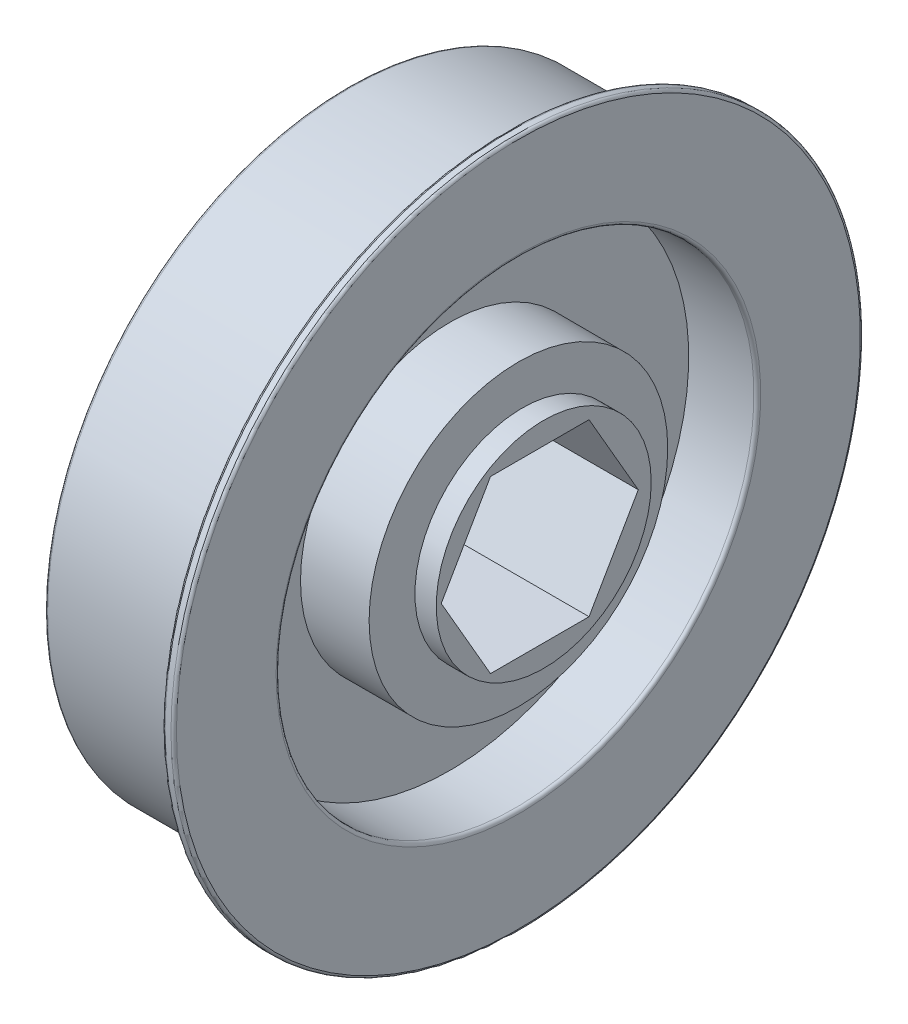
ISO-10303-21;
HEADER;
FILE_DESCRIPTION(('STEP AP214'),'2;1');
FILE_NAME('part.step','',(''),(''),'','','');
FILE_SCHEMA(('AUTOMOTIVE_DESIGN { 1 0 10303 214 1 1 1 1 }'));
ENDSEC;
DATA;
#1=APPLICATION_CONTEXT('core data for automotive mechanical design processes');
#2=APPLICATION_PROTOCOL_DEFINITION('international standard','automotive_design',2000,#1);
#3=PRODUCT_CONTEXT('',#1,'mechanical');
#4=PRODUCT('Part','Part','',(#3));
#5=PRODUCT_RELATED_PRODUCT_CATEGORY('part','',(#4));
#6=PRODUCT_DEFINITION_FORMATION('','',#4);
#7=PRODUCT_DEFINITION_CONTEXT('part definition',#1,'design');
#8=PRODUCT_DEFINITION('design','',#6,#7);
#9=PRODUCT_DEFINITION_SHAPE('','',#8);
#10=(LENGTH_UNIT() NAMED_UNIT(*) SI_UNIT(.MILLI.,.METRE.));
#11=(NAMED_UNIT(*) PLANE_ANGLE_UNIT() SI_UNIT($,.RADIAN.));
#12=(NAMED_UNIT(*) SI_UNIT($,.STERADIAN.) SOLID_ANGLE_UNIT());
#13=UNCERTAINTY_MEASURE_WITH_UNIT(LENGTH_MEASURE(1.E-05),#10,'distance_accuracy_value','');
#14=(GEOMETRIC_REPRESENTATION_CONTEXT(3) GLOBAL_UNCERTAINTY_ASSIGNED_CONTEXT((#13)) GLOBAL_UNIT_ASSIGNED_CONTEXT((#10,
#11,#12)) REPRESENTATION_CONTEXT('',''));
#15=CARTESIAN_POINT('',(0.,0.,0.));
#16=DIRECTION('',(0.,0.,1.));
#17=DIRECTION('',(1.,0.,0.));
#18=AXIS2_PLACEMENT_3D('',#15,#16,#17);
#19=CARTESIAN_POINT('',(10.3224617446627,0.,0.));
#20=DIRECTION('',(-1.,0.,0.));
#21=DIRECTION('',(0.,0.,1.));
#22=AXIS2_PLACEMENT_3D('',#19,#20,#21);
#23=CYLINDRICAL_SURFACE('',#22,11.1125);
#24=CARTESIAN_POINT('',(-1.13665,0.,0.));
#25=DIRECTION('',(-1.,0.,0.));
#26=DIRECTION('',(0.,0.,1.));
#27=AXIS2_PLACEMENT_3D('',#24,#25,#26);
#28=CIRCLE('',#27,11.1125);
#29=CARTESIAN_POINT('',(-1.13665,0.,11.1125));
#30=VERTEX_POINT('',#29);
#31=EDGE_CURVE('E146',#30,#30,#28,.T.);
#32=ORIENTED_EDGE('',*,*,#31,.F.);
#33=EDGE_LOOP('',(#32));
#34=FACE_BOUND('',#33,.T.);
#35=CARTESIAN_POINT('',(3.96875,0.,0.));
#36=DIRECTION('',(1.,0.,0.));
#37=DIRECTION('',(0.,0.,-1.));
#38=AXIS2_PLACEMENT_3D('',#35,#36,#37);
#39=CIRCLE('',#38,11.1125);
#40=CARTESIAN_POINT('',(3.96875,0.,-11.1125));
#41=VERTEX_POINT('',#40);
#42=EDGE_CURVE('E113',#41,#41,#39,.T.);
#43=ORIENTED_EDGE('',*,*,#42,.F.);
#44=EDGE_LOOP('',(#43));
#45=FACE_BOUND('',#44,.T.);
#46=ADVANCED_FACE('F35',(#34,#45),#23,.T.);
#47=CARTESIAN_POINT('',(5.55625,0.,0.));
#48=DIRECTION('',(1.,0.,0.));
#49=DIRECTION('',(0.,0.,-1.));
#50=AXIS2_PLACEMENT_3D('',#47,#48,#49);
#51=PLANE('',#50);
#52=DIRECTION('',(0.,0.866025403784438,-0.5));
#53=VECTOR('',#52,1.);
#54=CARTESIAN_POINT('',(5.55625,0.,7.33234841870825));
#55=LINE('',#54,#53);
#56=CARTESIAN_POINT('',(5.55625,0.,7.33234841870825));
#57=VERTEX_POINT('',#56);
#58=CARTESIAN_POINT('',(5.55625,6.35,3.66617420935412));
#59=VERTEX_POINT('',#58);
#60=EDGE_CURVE('E90',#57,#59,#55,.T.);
#61=ORIENTED_EDGE('',*,*,#60,.T.);
#62=DIRECTION('',(0.,0.,-1.));
#63=VECTOR('',#62,1.);
#64=CARTESIAN_POINT('',(5.55625,6.35,3.66617420935412));
#65=LINE('',#64,#63);
#66=CARTESIAN_POINT('',(5.55625,6.35,-3.66617420935412));
#67=VERTEX_POINT('',#66);
#68=EDGE_CURVE('E99',#59,#67,#65,.T.);
#69=ORIENTED_EDGE('',*,*,#68,.T.);
#70=DIRECTION('',(0.,-0.866025403784439,-0.5));
#71=VECTOR('',#70,1.);
#72=CARTESIAN_POINT('',(5.55625,6.35,-3.66617420935412));
#73=LINE('',#72,#71);
#74=CARTESIAN_POINT('',(5.55625,0.,-7.33234841870825));
#75=VERTEX_POINT('',#74);
#76=EDGE_CURVE('E50',#67,#75,#73,.T.);
#77=ORIENTED_EDGE('',*,*,#76,.T.);
#78=DIRECTION('',(0.,-0.866025403784439,0.5));
#79=VECTOR('',#78,1.);
#80=CARTESIAN_POINT('',(5.55625,0.,-7.33234841870825));
#81=LINE('',#80,#79);
#82=CARTESIAN_POINT('',(5.55625,-6.35,-3.66617420935412));
#83=VERTEX_POINT('',#82);
#84=EDGE_CURVE('E117',#75,#83,#81,.T.);
#85=ORIENTED_EDGE('',*,*,#84,.T.);
#86=DIRECTION('',(0.,0.,1.));
#87=VECTOR('',#86,1.);
#88=CARTESIAN_POINT('',(5.55625,-6.35,-3.66617420935412));
#89=LINE('',#88,#87);
#90=CARTESIAN_POINT('',(5.55625,-6.35,3.66617420935412));
#91=VERTEX_POINT('',#90);
#92=EDGE_CURVE('E120',#83,#91,#89,.T.);
#93=ORIENTED_EDGE('',*,*,#92,.T.);
#94=DIRECTION('',(0.,0.866025403784439,0.5));
#95=VECTOR('',#94,1.);
#96=CARTESIAN_POINT('',(5.55625,-6.35,3.66617420935412));
#97=LINE('',#96,#95);
#98=EDGE_CURVE('E96',#91,#57,#97,.T.);
#99=ORIENTED_EDGE('',*,*,#98,.T.);
#100=EDGE_LOOP('',(#61,#69,#77,#85,#93,#99));
#101=FACE_BOUND('',#100,.T.);
#102=CARTESIAN_POINT('',(5.55625,0.,-0.296341565160674));
#103=DIRECTION('',(1.,0.,0.));
#104=DIRECTION('',(0.,0.,-1.));
#105=AXIS2_PLACEMENT_3D('',#102,#103,#104);
#106=CIRCLE('',#105,8.);
#107=CARTESIAN_POINT('',(5.55625,0.,-8.29634156516068));
#108=VERTEX_POINT('',#107);
#109=EDGE_CURVE('E404',#108,#108,#106,.T.);
#110=ORIENTED_EDGE('',*,*,#109,.T.);
#111=EDGE_LOOP('',(#110));
#112=FACE_BOUND('',#111,.T.);
#113=ADVANCED_FACE('F103',(#101,#112),#51,.T.);
#114=CARTESIAN_POINT('',(10.3224617446627,0.,0.));
#115=DIRECTION('',(-1.,0.,0.));
#116=DIRECTION('',(0.,0.,1.));
#117=AXIS2_PLACEMENT_3D('',#114,#115,#116);
#118=CYLINDRICAL_SURFACE('',#117,11.1125);
#119=CARTESIAN_POINT('',(-3.42265,0.,0.));
#120=DIRECTION('',(-1.,0.,0.));
#121=DIRECTION('',(0.,0.,1.));
#122=AXIS2_PLACEMENT_3D('',#119,#120,#121);
#123=CIRCLE('',#122,11.1125);
#124=CARTESIAN_POINT('',(-3.42265,0.,11.1125));
#125=VERTEX_POINT('',#124);
#126=EDGE_CURVE('E11',#125,#125,#123,.T.);
#127=ORIENTED_EDGE('',*,*,#126,.T.);
#128=EDGE_LOOP('',(#127));
#129=FACE_BOUND('',#128,.T.);
#130=CARTESIAN_POINT('',(-7.14375000000375,0.,0.));
#131=DIRECTION('',(-1.,0.,0.));
#132=DIRECTION('',(0.,0.,1.));
#133=AXIS2_PLACEMENT_3D('',#130,#131,#132);
#134=CIRCLE('',#133,11.1125);
#135=CARTESIAN_POINT('',(-7.14375000000375,0.,11.1125));
#136=VERTEX_POINT('',#135);
#137=EDGE_CURVE('E136',#136,#136,#134,.T.);
#138=ORIENTED_EDGE('',*,*,#137,.F.);
#139=EDGE_LOOP('',(#138));
#140=FACE_BOUND('',#139,.T.);
#141=ADVANCED_FACE('F37',(#129,#140),#118,.T.);
#142=CARTESIAN_POINT('',(-3.42265,11.1125,0.));
#143=DIRECTION('',(-1.,0.,0.));
#144=DIRECTION('',(0.,0.,1.));
#145=AXIS2_PLACEMENT_3D('',#142,#143,#144);
#146=PLANE('',#145);
#147=CARTESIAN_POINT('',(-3.42265,0.,0.));
#148=DIRECTION('',(-1.,0.,0.));
#149=DIRECTION('',(0.,0.,1.));
#150=AXIS2_PLACEMENT_3D('',#147,#148,#149);
#151=CIRCLE('',#150,17.78);
#152=CARTESIAN_POINT('',(-3.42265,0.,17.78));
#153=VERTEX_POINT('',#152);
#154=EDGE_CURVE('E43',#153,#153,#151,.T.);
#155=ORIENTED_EDGE('',*,*,#154,.T.);
#156=EDGE_LOOP('',(#155));
#157=FACE_BOUND('',#156,.T.);
#158=ORIENTED_EDGE('',*,*,#126,.F.);
#159=EDGE_LOOP('',(#158));
#160=FACE_BOUND('',#159,.T.);
#161=ADVANCED_FACE('F190',(#157,#160),#146,.T.);
#162=CARTESIAN_POINT('',(10.3224617446627,0.,0.));
#163=DIRECTION('',(-1.,0.,0.));
#164=DIRECTION('',(0.,0.,1.));
#165=AXIS2_PLACEMENT_3D('',#162,#163,#164);
#166=CYLINDRICAL_SURFACE('',#165,17.78);
#167=CARTESIAN_POINT('',(-8.47725,0.,0.));
#168=DIRECTION('',(-1.,0.,0.));
#169=DIRECTION('',(0.,0.,1.));
#170=AXIS2_PLACEMENT_3D('',#167,#168,#169);
#171=CIRCLE('',#170,17.78);
#172=CARTESIAN_POINT('',(-8.47725,0.,17.78));
#173=VERTEX_POINT('',#172);
#174=EDGE_CURVE('E185',#173,#173,#171,.T.);
#175=ORIENTED_EDGE('',*,*,#174,.T.);
#176=EDGE_LOOP('',(#175));
#177=FACE_BOUND('',#176,.T.);
#178=ORIENTED_EDGE('',*,*,#154,.F.);
#179=EDGE_LOOP('',(#178));
#180=FACE_BOUND('',#179,.T.);
#181=ADVANCED_FACE('F193',(#177,#180),#166,.F.);
#182=CARTESIAN_POINT('',(-8.47725,0.,0.));
#183=DIRECTION('',(-1.,0.,0.));
#184=DIRECTION('',(0.,0.,1.));
#185=AXIS2_PLACEMENT_3D('',#182,#183,#184);
#186=TOROIDAL_SURFACE('',#185,18.034,0.254000000000002);
#187=CARTESIAN_POINT('',(-8.73125,0.,0.));
#188=DIRECTION('',(-1.,0.,0.));
#189=DIRECTION('',(0.,0.,1.));
#190=AXIS2_PLACEMENT_3D('',#187,#188,#189);
#191=CIRCLE('',#190,18.034);
#192=CARTESIAN_POINT('',(-8.73125,0.,18.034));
#193=VERTEX_POINT('',#192);
#194=EDGE_CURVE('E182',#193,#193,#191,.T.);
#195=ORIENTED_EDGE('',*,*,#194,.T.);
#196=EDGE_LOOP('',(#195));
#197=FACE_BOUND('',#196,.T.);
#198=ORIENTED_EDGE('',*,*,#174,.F.);
#199=EDGE_LOOP('',(#198));
#200=FACE_BOUND('',#199,.T.);
#201=ADVANCED_FACE('F195',(#197,#200),#186,.T.);
#202=CARTESIAN_POINT('',(-8.73125,18.034,0.));
#203=DIRECTION('',(-1.,0.,0.));
#204=DIRECTION('',(0.,0.,1.));
#205=AXIS2_PLACEMENT_3D('',#202,#203,#204);
#206=PLANE('',#205);
#207=CARTESIAN_POINT('',(-8.73125,0.,0.));
#208=DIRECTION('',(-1.,0.,0.));
#209=DIRECTION('',(0.,0.,1.));
#210=AXIS2_PLACEMENT_3D('',#207,#208,#209);
#211=CIRCLE('',#210,22.3393000000002);
#212=CARTESIAN_POINT('',(-8.73125,0.,22.3393000000002));
#213=VERTEX_POINT('',#212);
#214=EDGE_CURVE('E179',#213,#213,#211,.T.);
#215=ORIENTED_EDGE('',*,*,#214,.T.);
#216=EDGE_LOOP('',(#215));
#217=FACE_BOUND('',#216,.T.);
#218=ORIENTED_EDGE('',*,*,#194,.F.);
#219=EDGE_LOOP('',(#218));
#220=FACE_BOUND('',#219,.T.);
#221=ADVANCED_FACE('F202',(#217,#220),#206,.T.);
#222=CARTESIAN_POINT('',(-8.52805,0.,0.));
#223=DIRECTION('',(-1.,0.,0.));
#224=DIRECTION('',(0.,0.,1.));
#225=AXIS2_PLACEMENT_3D('',#222,#223,#224);
#226=TOROIDAL_SURFACE('',#225,22.3393,0.203200000000001);
#227=CARTESIAN_POINT('',(-8.52805,0.,0.));
#228=DIRECTION('',(-1.,0.,0.));
#229=DIRECTION('',(0.,0.,1.));
#230=AXIS2_PLACEMENT_3D('',#227,#228,#229);
#231=CIRCLE('',#230,22.5425);
#232=CARTESIAN_POINT('',(-8.52805,0.,22.5425));
#233=VERTEX_POINT('',#232);
#234=EDGE_CURVE('E176',#233,#233,#231,.T.);
#235=ORIENTED_EDGE('',*,*,#234,.T.);
#236=EDGE_LOOP('',(#235));
#237=FACE_BOUND('',#236,.T.);
#238=ORIENTED_EDGE('',*,*,#214,.F.);
#239=EDGE_LOOP('',(#238));
#240=FACE_BOUND('',#239,.T.);
#241=ADVANCED_FACE('F257',(#237,#240),#226,.T.);
#242=CARTESIAN_POINT('',(10.3224617446627,0.,0.));
#243=DIRECTION('',(-1.,0.,0.));
#244=DIRECTION('',(0.,0.,1.));
#245=AXIS2_PLACEMENT_3D('',#242,#243,#244);
#246=CYLINDRICAL_SURFACE('',#245,22.5425000000001);
#247=CARTESIAN_POINT('',(2.22337911188569,0.,0.));
#248=DIRECTION('',(-1.,0.,0.));
#249=DIRECTION('',(0.,0.,1.));
#250=AXIS2_PLACEMENT_3D('',#247,#248,#249);
#251=CIRCLE('',#250,22.5425000000003);
#252=CARTESIAN_POINT('',(2.22337911188569,0.,22.5425000000003));
#253=VERTEX_POINT('',#252);
#254=EDGE_CURVE('E173',#253,#253,#251,.T.);
#255=ORIENTED_EDGE('',*,*,#254,.T.);
#256=EDGE_LOOP('',(#255));
#257=FACE_BOUND('',#256,.T.);
#258=ORIENTED_EDGE('',*,*,#234,.F.);
#259=EDGE_LOOP('',(#258));
#260=FACE_BOUND('',#259,.T.);
#261=ADVANCED_FACE('F253',(#257,#260),#246,.T.);
#262=CARTESIAN_POINT('',(2.22337911188592,0.,0.));
#263=DIRECTION('',(-1.,0.,0.));
#264=DIRECTION('',(0.,0.,1.));
#265=AXIS2_PLACEMENT_3D('',#262,#263,#264);
#266=TOROIDAL_SURFACE('',#265,22.7457,0.203199999999699);
#267=CARTESIAN_POINT('',(2.42027343287945,0.,0.));
#268=DIRECTION('',(-1.,0.,0.));
#269=DIRECTION('',(0.,0.,1.));
#270=AXIS2_PLACEMENT_3D('',#267,#268,#269);
#271=CIRCLE('',#270,22.6954718568894);
#272=CARTESIAN_POINT('',(2.42027343287945,0.,22.6954718568894));
#273=VERTEX_POINT('',#272);
#274=EDGE_CURVE('E170',#273,#273,#271,.T.);
#275=ORIENTED_EDGE('',*,*,#274,.T.);
#276=EDGE_LOOP('',(#275));
#277=FACE_BOUND('',#276,.T.);
#278=ORIENTED_EDGE('',*,*,#254,.F.);
#279=EDGE_LOOP('',(#278));
#280=FACE_BOUND('',#279,.T.);
#281=ADVANCED_FACE('F249',(#277,#280),#266,.F.);
#282=CARTESIAN_POINT('',(2.42027343287945,0.,0.));
#283=DIRECTION('',(1.,0.,0.));
#284=DIRECTION('',(0.,0.,-1.));
#285=AXIS2_PLACEMENT_3D('',#282,#283,#284);
#286=CONICAL_SURFACE('',#285,22.6954718568894,1.3210215373737);
#287=CARTESIAN_POINT('',(3.13597656711941,0.,0.));
#288=DIRECTION('',(-1.,0.,0.));
#289=DIRECTION('',(0.,0.,1.));
#290=AXIS2_PLACEMENT_3D('',#287,#288,#289);
#291=CIRCLE('',#290,25.5010281431107);
#292=CARTESIAN_POINT('',(3.13597656711941,0.,25.5010281431107));
#293=VERTEX_POINT('',#292);
#294=EDGE_CURVE('E167',#293,#293,#291,.T.);
#295=ORIENTED_EDGE('',*,*,#294,.T.);
#296=EDGE_LOOP('',(#295));
#297=FACE_BOUND('',#296,.T.);
#298=ORIENTED_EDGE('',*,*,#274,.F.);
#299=EDGE_LOOP('',(#298));
#300=FACE_BOUND('',#299,.T.);
#301=ADVANCED_FACE('F245',(#297,#300),#286,.T.);
#302=CARTESIAN_POINT('',(3.33287088811332,0.,0.));
#303=DIRECTION('',(-1.,0.,0.));
#304=DIRECTION('',(0.,0.,1.));
#305=AXIS2_PLACEMENT_3D('',#302,#303,#304);
#306=TOROIDAL_SURFACE('',#305,25.4508,0.203200000000004);
#307=CARTESIAN_POINT('',(3.33287088811332,0.,0.));
#308=DIRECTION('',(-1.,0.,0.));
#309=DIRECTION('',(0.,0.,1.));
#310=AXIS2_PLACEMENT_3D('',#307,#308,#309);
#311=CIRCLE('',#310,25.654);
#312=CARTESIAN_POINT('',(3.33287088811332,0.,25.654));
#313=VERTEX_POINT('',#312);
#314=EDGE_CURVE('E164',#313,#313,#311,.T.);
#315=ORIENTED_EDGE('',*,*,#314,.T.);
#316=EDGE_LOOP('',(#315));
#317=FACE_BOUND('',#316,.T.);
#318=ORIENTED_EDGE('',*,*,#294,.F.);
#319=EDGE_LOOP('',(#318));
#320=FACE_BOUND('',#319,.T.);
#321=ADVANCED_FACE('F241',(#317,#320),#306,.T.);
#322=CARTESIAN_POINT('',(10.3224617446627,0.,0.));
#323=DIRECTION('',(-1.,0.,0.));
#324=DIRECTION('',(0.,0.,1.));
#325=AXIS2_PLACEMENT_3D('',#322,#323,#324);
#326=CYLINDRICAL_SURFACE('',#325,25.654);
#327=CARTESIAN_POINT('',(3.76555,0.,0.));
#328=DIRECTION('',(-1.,0.,0.));
#329=DIRECTION('',(0.,0.,1.));
#330=AXIS2_PLACEMENT_3D('',#327,#328,#329);
#331=CIRCLE('',#330,25.654);
#332=CARTESIAN_POINT('',(3.76555,0.,25.654));
#333=VERTEX_POINT('',#332);
#334=EDGE_CURVE('E161',#333,#333,#331,.T.);
#335=ORIENTED_EDGE('',*,*,#334,.T.);
#336=EDGE_LOOP('',(#335));
#337=FACE_BOUND('',#336,.T.);
#338=ORIENTED_EDGE('',*,*,#314,.F.);
#339=EDGE_LOOP('',(#338));
#340=FACE_BOUND('',#339,.T.);
#341=ADVANCED_FACE('F237',(#337,#340),#326,.T.);
#342=CARTESIAN_POINT('',(3.76555,0.,0.));
#343=DIRECTION('',(-1.,0.,0.));
#344=DIRECTION('',(0.,0.,1.));
#345=AXIS2_PLACEMENT_3D('',#342,#343,#344);
#346=TOROIDAL_SURFACE('',#345,25.4508,0.2032);
#347=CARTESIAN_POINT('',(3.96875,0.,0.));
#348=DIRECTION('',(-1.,0.,0.));
#349=DIRECTION('',(0.,0.,1.));
#350=AXIS2_PLACEMENT_3D('',#347,#348,#349);
#351=CIRCLE('',#350,25.4508);
#352=CARTESIAN_POINT('',(3.96875,0.,25.4508));
#353=VERTEX_POINT('',#352);
#354=EDGE_CURVE('E158',#353,#353,#351,.T.);
#355=ORIENTED_EDGE('',*,*,#354,.T.);
#356=EDGE_LOOP('',(#355));
#357=FACE_BOUND('',#356,.T.);
#358=ORIENTED_EDGE('',*,*,#334,.F.);
#359=EDGE_LOOP('',(#358));
#360=FACE_BOUND('',#359,.T.);
#361=ADVANCED_FACE('F233',(#357,#360),#346,.T.);
#362=CARTESIAN_POINT('',(3.96875,25.4508,0.));
#363=DIRECTION('',(1.,0.,0.));
#364=DIRECTION('',(0.,0.,-1.));
#365=AXIS2_PLACEMENT_3D('',#362,#363,#364);
#366=PLANE('',#365);
#367=CARTESIAN_POINT('',(3.96875,0.,0.));
#368=DIRECTION('',(-1.,0.,0.));
#369=DIRECTION('',(0.,0.,1.));
#370=AXIS2_PLACEMENT_3D('',#367,#368,#369);
#371=CIRCLE('',#370,18.034);
#372=CARTESIAN_POINT('',(3.96875,0.,18.034));
#373=VERTEX_POINT('',#372);
#374=EDGE_CURVE('E155',#373,#373,#371,.T.);
#375=ORIENTED_EDGE('',*,*,#374,.T.);
#376=EDGE_LOOP('',(#375));
#377=FACE_BOUND('',#376,.T.);
#378=ORIENTED_EDGE('',*,*,#354,.F.);
#379=EDGE_LOOP('',(#378));
#380=FACE_BOUND('',#379,.T.);
#381=ADVANCED_FACE('F229',(#377,#380),#366,.T.);
#382=CARTESIAN_POINT('',(3.71475,0.,0.));
#383=DIRECTION('',(-1.,0.,0.));
#384=DIRECTION('',(0.,0.,1.));
#385=AXIS2_PLACEMENT_3D('',#382,#383,#384);
#386=TOROIDAL_SURFACE('',#385,18.034,0.253999999999999);
#387=CARTESIAN_POINT('',(3.71475,0.,0.));
#388=DIRECTION('',(-1.,0.,0.));
#389=DIRECTION('',(0.,0.,1.));
#390=AXIS2_PLACEMENT_3D('',#387,#388,#389);
#391=CIRCLE('',#390,17.78);
#392=CARTESIAN_POINT('',(3.71475,0.,17.78));
#393=VERTEX_POINT('',#392);
#394=EDGE_CURVE('E152',#393,#393,#391,.T.);
#395=ORIENTED_EDGE('',*,*,#394,.T.);
#396=EDGE_LOOP('',(#395));
#397=FACE_BOUND('',#396,.T.);
#398=ORIENTED_EDGE('',*,*,#374,.F.);
#399=EDGE_LOOP('',(#398));
#400=FACE_BOUND('',#399,.T.);
#401=ADVANCED_FACE('F225',(#397,#400),#386,.T.);
#402=CARTESIAN_POINT('',(10.3224617446627,0.,0.));
#403=DIRECTION('',(-1.,0.,0.));
#404=DIRECTION('',(0.,0.,1.));
#405=AXIS2_PLACEMENT_3D('',#402,#403,#404);
#406=CYLINDRICAL_SURFACE('',#405,17.78);
#407=CARTESIAN_POINT('',(-1.13665,0.,0.));
#408=DIRECTION('',(-1.,0.,0.));
#409=DIRECTION('',(0.,0.,1.));
#410=AXIS2_PLACEMENT_3D('',#407,#408,#409);
#411=CIRCLE('',#410,17.78);
#412=CARTESIAN_POINT('',(-1.13665,0.,17.78));
#413=VERTEX_POINT('',#412);
#414=EDGE_CURVE('E149',#413,#413,#411,.T.);
#415=ORIENTED_EDGE('',*,*,#414,.T.);
#416=EDGE_LOOP('',(#415));
#417=FACE_BOUND('',#416,.T.);
#418=ORIENTED_EDGE('',*,*,#394,.F.);
#419=EDGE_LOOP('',(#418));
#420=FACE_BOUND('',#419,.T.);
#421=ADVANCED_FACE('F221',(#417,#420),#406,.F.);
#422=CARTESIAN_POINT('',(-1.13665,17.78,0.));
#423=DIRECTION('',(1.,0.,0.));
#424=DIRECTION('',(0.,0.,-1.));
#425=AXIS2_PLACEMENT_3D('',#422,#423,#424);
#426=PLANE('',#425);
#427=ORIENTED_EDGE('',*,*,#31,.T.);
#428=EDGE_LOOP('',(#427));
#429=FACE_BOUND('',#428,.T.);
#430=ORIENTED_EDGE('',*,*,#414,.F.);
#431=EDGE_LOOP('',(#430));
#432=FACE_BOUND('',#431,.T.);
#433=ADVANCED_FACE('F217',(#429,#432),#426,.T.);
#434=CARTESIAN_POINT('',(-7.14375000000375,0.,0.));
#435=DIRECTION('',(-1.,0.,0.));
#436=DIRECTION('',(0.,0.,1.));
#437=AXIS2_PLACEMENT_3D('',#434,#435,#436);
#438=PLANE('',#437);
#439=DIRECTION('',(0.,0.866025403784438,-0.5));
#440=VECTOR('',#439,1.);
#441=CARTESIAN_POINT('',(-7.14375000000375,0.,7.33234841870825));
#442=LINE('',#441,#440);
#443=CARTESIAN_POINT('',(-7.14375000000375,0.,7.33234841870825));
#444=VERTEX_POINT('',#443);
#445=CARTESIAN_POINT('',(-7.14375000000375,6.35,3.66617420935412));
#446=VERTEX_POINT('',#445);
#447=EDGE_CURVE('E58',#444,#446,#442,.T.);
#448=ORIENTED_EDGE('',*,*,#447,.F.);
#449=DIRECTION('',(0.,0.866025403784439,0.5));
#450=VECTOR('',#449,1.);
#451=CARTESIAN_POINT('',(-7.14375000000375,-6.35,3.66617420935412));
#452=LINE('',#451,#450);
#453=CARTESIAN_POINT('',(-7.14375000000375,-6.35,3.66617420935412));
#454=VERTEX_POINT('',#453);
#455=EDGE_CURVE('E107',#454,#444,#452,.T.);
#456=ORIENTED_EDGE('',*,*,#455,.F.);
#457=DIRECTION('',(0.,0.,1.));
#458=VECTOR('',#457,1.);
#459=CARTESIAN_POINT('',(-7.14375000000375,-6.35,-3.66617420935412));
#460=LINE('',#459,#458);
#461=CARTESIAN_POINT('',(-7.14375000000375,-6.35,-3.66617420935412));
#462=VERTEX_POINT('',#461);
#463=EDGE_CURVE('E110',#462,#454,#460,.T.);
#464=ORIENTED_EDGE('',*,*,#463,.F.);
#465=DIRECTION('',(0.,-0.866025403784439,0.5));
#466=VECTOR('',#465,1.);
#467=CARTESIAN_POINT('',(-7.14375000000375,0.,-7.33234841870825));
#468=LINE('',#467,#466);
#469=CARTESIAN_POINT('',(-7.14375000000375,0.,-7.33234841870825));
#470=VERTEX_POINT('',#469);
#471=EDGE_CURVE('E129',#470,#462,#468,.T.);
#472=ORIENTED_EDGE('',*,*,#471,.F.);
#473=DIRECTION('',(0.,-0.866025403784439,-0.5));
#474=VECTOR('',#473,1.);
#475=CARTESIAN_POINT('',(-7.14375000000375,6.35,-3.66617420935412));
#476=LINE('',#475,#474);
#477=CARTESIAN_POINT('',(-7.14375000000375,6.35,-3.66617420935412));
#478=VERTEX_POINT('',#477);
#479=EDGE_CURVE('E126',#478,#470,#476,.T.);
#480=ORIENTED_EDGE('',*,*,#479,.F.);
#481=DIRECTION('',(0.,0.,-1.));
#482=VECTOR('',#481,1.);
#483=CARTESIAN_POINT('',(-7.14375000000375,6.35,3.66617420935412));
#484=LINE('',#483,#482);
#485=EDGE_CURVE('E124',#446,#478,#484,.T.);
#486=ORIENTED_EDGE('',*,*,#485,.F.);
#487=EDGE_LOOP('',(#448,#456,#464,#472,#480,#486));
#488=FACE_BOUND('',#487,.T.);
#489=ORIENTED_EDGE('',*,*,#137,.T.);
#490=EDGE_LOOP('',(#489));
#491=FACE_BOUND('',#490,.T.);
#492=ADVANCED_FACE('F220',(#488,#491),#438,.T.);
#493=CARTESIAN_POINT('',(5.55625,0.,7.33234841870825));
#494=DIRECTION('',(0.,0.5,0.866025403784438));
#495=DIRECTION('',(0.,-0.866025403784439,0.5));
#496=AXIS2_PLACEMENT_3D('',#493,#494,#495);
#497=PLANE('',#496);
#498=ORIENTED_EDGE('',*,*,#447,.T.);
#499=DIRECTION('',(-1.,0.,0.));
#500=VECTOR('',#499,1.);
#501=CARTESIAN_POINT('',(5.55625,6.35,3.66617420935412));
#502=LINE('',#501,#500);
#503=EDGE_CURVE('E86',#59,#446,#502,.T.);
#504=ORIENTED_EDGE('',*,*,#503,.F.);
#505=ORIENTED_EDGE('',*,*,#60,.F.);
#506=DIRECTION('',(-1.,0.,0.));
#507=VECTOR('',#506,1.);
#508=CARTESIAN_POINT('',(5.55625,0.,7.33234841870825));
#509=LINE('',#508,#507);
#510=EDGE_CURVE('E134',#57,#444,#509,.T.);
#511=ORIENTED_EDGE('',*,*,#510,.T.);
#512=EDGE_LOOP('',(#498,#504,#505,#511));
#513=FACE_BOUND('',#512,.T.);
#514=ADVANCED_FACE('F88',(#513),#497,.F.);
#515=CARTESIAN_POINT('',(5.55625,-6.35,3.66617420935412));
#516=DIRECTION('',(0.,-0.5,0.866025403784439));
#517=DIRECTION('',(0.,-0.866025403784439,-0.5));
#518=AXIS2_PLACEMENT_3D('',#515,#516,#517);
#519=PLANE('',#518);
#520=ORIENTED_EDGE('',*,*,#455,.T.);
#521=ORIENTED_EDGE('',*,*,#510,.F.);
#522=ORIENTED_EDGE('',*,*,#98,.F.);
#523=DIRECTION('',(-1.,0.,0.));
#524=VECTOR('',#523,1.);
#525=CARTESIAN_POINT('',(5.55625,-6.35,3.66617420935412));
#526=LINE('',#525,#524);
#527=EDGE_CURVE('E137',#91,#454,#526,.T.);
#528=ORIENTED_EDGE('',*,*,#527,.T.);
#529=EDGE_LOOP('',(#520,#521,#522,#528));
#530=FACE_BOUND('',#529,.T.);
#531=ADVANCED_FACE('F331',(#530),#519,.F.);
#532=CARTESIAN_POINT('',(5.55625,-6.35,-3.66617420935412));
#533=DIRECTION('',(0.,-1.,0.));
#534=DIRECTION('',(0.,0.,-1.));
#535=AXIS2_PLACEMENT_3D('',#532,#533,#534);
#536=PLANE('',#535);
#537=ORIENTED_EDGE('',*,*,#463,.T.);
#538=ORIENTED_EDGE('',*,*,#527,.F.);
#539=ORIENTED_EDGE('',*,*,#92,.F.);
#540=DIRECTION('',(-1.,0.,0.));
#541=VECTOR('',#540,1.);
#542=CARTESIAN_POINT('',(5.55625,-6.35,-3.66617420935412));
#543=LINE('',#542,#541);
#544=EDGE_CURVE('E139',#83,#462,#543,.T.);
#545=ORIENTED_EDGE('',*,*,#544,.T.);
#546=EDGE_LOOP('',(#537,#538,#539,#545));
#547=FACE_BOUND('',#546,.T.);
#548=ADVANCED_FACE('F338',(#547),#536,.F.);
#549=CARTESIAN_POINT('',(5.55625,0.,-7.33234841870825));
#550=DIRECTION('',(0.,-0.5,-0.866025403784439));
#551=DIRECTION('',(0.,0.866025403784439,-0.5));
#552=AXIS2_PLACEMENT_3D('',#549,#550,#551);
#553=PLANE('',#552);
#554=ORIENTED_EDGE('',*,*,#471,.T.);
#555=ORIENTED_EDGE('',*,*,#544,.F.);
#556=ORIENTED_EDGE('',*,*,#84,.F.);
#557=DIRECTION('',(-1.,0.,0.));
#558=VECTOR('',#557,1.);
#559=CARTESIAN_POINT('',(5.55625,0.,-7.33234841870825));
#560=LINE('',#559,#558);
#561=EDGE_CURVE('E141',#75,#470,#560,.T.);
#562=ORIENTED_EDGE('',*,*,#561,.T.);
#563=EDGE_LOOP('',(#554,#555,#556,#562));
#564=FACE_BOUND('',#563,.T.);
#565=ADVANCED_FACE('F346',(#564),#553,.F.);
#566=CARTESIAN_POINT('',(5.55625,6.35,-3.66617420935412));
#567=DIRECTION('',(0.,0.5,-0.866025403784439));
#568=DIRECTION('',(0.,0.866025403784439,0.5));
#569=AXIS2_PLACEMENT_3D('',#566,#567,#568);
#570=PLANE('',#569);
#571=ORIENTED_EDGE('',*,*,#479,.T.);
#572=ORIENTED_EDGE('',*,*,#561,.F.);
#573=ORIENTED_EDGE('',*,*,#76,.F.);
#574=DIRECTION('',(-1.,0.,0.));
#575=VECTOR('',#574,1.);
#576=CARTESIAN_POINT('',(5.55625,6.35,-3.66617420935412));
#577=LINE('',#576,#575);
#578=EDGE_CURVE('E95',#67,#478,#577,.T.);
#579=ORIENTED_EDGE('',*,*,#578,.T.);
#580=EDGE_LOOP('',(#571,#572,#573,#579));
#581=FACE_BOUND('',#580,.T.);
#582=ADVANCED_FACE('F354',(#581),#570,.F.);
#583=CARTESIAN_POINT('',(5.55625,6.35,3.66617420935412));
#584=DIRECTION('',(0.,1.,0.));
#585=DIRECTION('',(0.,0.,1.));
#586=AXIS2_PLACEMENT_3D('',#583,#584,#585);
#587=PLANE('',#586);
#588=ORIENTED_EDGE('',*,*,#485,.T.);
#589=ORIENTED_EDGE('',*,*,#578,.F.);
#590=ORIENTED_EDGE('',*,*,#68,.F.);
#591=ORIENTED_EDGE('',*,*,#503,.T.);
#592=EDGE_LOOP('',(#588,#589,#590,#591));
#593=FACE_BOUND('',#592,.T.);
#594=ADVANCED_FACE('F100',(#593),#587,.F.);
#595=CARTESIAN_POINT('',(3.96875,0.,0.));
#596=DIRECTION('',(1.,0.,0.));
#597=DIRECTION('',(0.,0.,-1.));
#598=AXIS2_PLACEMENT_3D('',#595,#596,#597);
#599=PLANE('',#598);
#600=CARTESIAN_POINT('',(3.96875,0.,-0.296341565160674));
#601=DIRECTION('',(1.,0.,0.));
#602=DIRECTION('',(0.,0.,-1.));
#603=AXIS2_PLACEMENT_3D('',#600,#601,#602);
#604=CIRCLE('',#603,8.);
#605=CARTESIAN_POINT('',(3.96875,0.,-8.29634156516068));
#606=VERTEX_POINT('',#605);
#607=EDGE_CURVE('E401',#606,#606,#604,.T.);
#608=ORIENTED_EDGE('',*,*,#607,.F.);
#609=EDGE_LOOP('',(#608));
#610=FACE_BOUND('',#609,.T.);
#611=ORIENTED_EDGE('',*,*,#42,.T.);
#612=EDGE_LOOP('',(#611));
#613=FACE_BOUND('',#612,.T.);
#614=ADVANCED_FACE('F367',(#610,#613),#599,.T.);
#615=CARTESIAN_POINT('',(3.96875,0.,-0.296341565160674));
#616=DIRECTION('',(1.,0.,0.));
#617=DIRECTION('',(0.,0.,-1.));
#618=AXIS2_PLACEMENT_3D('',#615,#616,#617);
#619=CYLINDRICAL_SURFACE('',#618,8.);
#620=ORIENTED_EDGE('',*,*,#607,.T.);
#621=EDGE_LOOP('',(#620));
#622=FACE_BOUND('',#621,.T.);
#623=ORIENTED_EDGE('',*,*,#109,.F.);
#624=EDGE_LOOP('',(#623));
#625=FACE_BOUND('',#624,.T.);
#626=ADVANCED_FACE('F384',(#622,#625),#619,.T.);
#627=CLOSED_SHELL('',(#46,#113,#141,#161,#181,#201,#221,#241,#261,#281,#301,#321,#341,#361,#381,
#401,#421,#433,#492,#514,#531,#548,#565,#582,#594,#614,#626));
#628=MANIFOLD_SOLID_BREP('B2',#627);
#629=ADVANCED_BREP_SHAPE_REPRESENTATION('',(#18,#628),#14);
#630=SHAPE_DEFINITION_REPRESENTATION(#9,#629);
ENDSEC;
END-ISO-10303-21;
